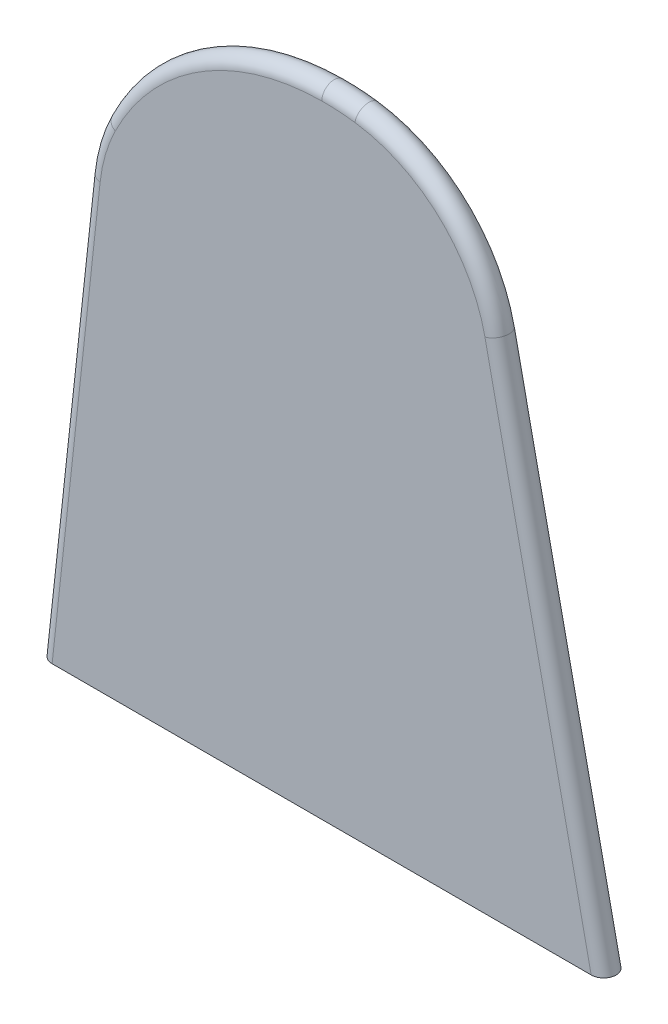
ISO-10303-21;
HEADER;
FILE_DESCRIPTION(('STEP AP214'),'2;1');
FILE_NAME('part.step','',(''),(''),'','','');
FILE_SCHEMA(('AUTOMOTIVE_DESIGN { 1 0 10303 214 1 1 1 1 }'));
ENDSEC;
DATA;
#1=APPLICATION_CONTEXT('core data for automotive mechanical design processes');
#2=APPLICATION_PROTOCOL_DEFINITION('international standard','automotive_design',2000,#1);
#3=PRODUCT_CONTEXT('',#1,'mechanical');
#4=PRODUCT('Part','Part','',(#3));
#5=PRODUCT_RELATED_PRODUCT_CATEGORY('part','',(#4));
#6=PRODUCT_DEFINITION_FORMATION('','',#4);
#7=PRODUCT_DEFINITION_CONTEXT('part definition',#1,'design');
#8=PRODUCT_DEFINITION('design','',#6,#7);
#9=PRODUCT_DEFINITION_SHAPE('','',#8);
#10=(LENGTH_UNIT() NAMED_UNIT(*) SI_UNIT(.MILLI.,.METRE.));
#11=(NAMED_UNIT(*) PLANE_ANGLE_UNIT() SI_UNIT($,.RADIAN.));
#12=(NAMED_UNIT(*) SI_UNIT($,.STERADIAN.) SOLID_ANGLE_UNIT());
#13=UNCERTAINTY_MEASURE_WITH_UNIT(LENGTH_MEASURE(1.E-05),#10,'distance_accuracy_value','');
#14=(GEOMETRIC_REPRESENTATION_CONTEXT(3) GLOBAL_UNCERTAINTY_ASSIGNED_CONTEXT((#13)) GLOBAL_UNIT_ASSIGNED_CONTEXT((#10,
#11,#12)) REPRESENTATION_CONTEXT('',''));
#15=CARTESIAN_POINT('',(0.,0.,0.));
#16=DIRECTION('',(0.,0.,1.));
#17=DIRECTION('',(1.,0.,0.));
#18=AXIS2_PLACEMENT_3D('',#15,#16,#17);
#19=CARTESIAN_POINT('',(1.10745661042956,42.0916931068543,1.105));
#20=DIRECTION('',(0.,0.,-1.));
#21=DIRECTION('',(-1.,0.,0.));
#22=AXIS2_PLACEMENT_3D('',#19,#20,#21);
#23=TOROIDAL_SURFACE('',#22,13.895,1.105);
#24=CARTESIAN_POINT('',(14.6981710796887,44.9836656542811,1.105));
#25=DIRECTION('',(0.208130446018487,-0.978101077312639,0.));
#26=DIRECTION('',(0.978101077312639,0.208130446018487,0.));
#27=AXIS2_PLACEMENT_3D('',#24,#25,#26);
#28=CIRCLE('',#27,1.105);
#29=CARTESIAN_POINT('',(14.6981710796887,44.9836656542811,0.));
#30=VERTEX_POINT('',#29);
#31=CARTESIAN_POINT('',(14.6981710796887,44.9836656542811,2.21));
#32=VERTEX_POINT('',#31);
#33=EDGE_CURVE('E11',#30,#32,#28,.T.);
#34=ORIENTED_EDGE('',*,*,#33,.F.);
#35=CARTESIAN_POINT('',(1.10745661042956,42.0916931068543,0.));
#36=DIRECTION('',(0.,0.,1.));
#37=DIRECTION('',(1.,0.,0.));
#38=AXIS2_PLACEMENT_3D('',#35,#36,#37);
#39=CIRCLE('',#38,13.895);
#40=CARTESIAN_POINT('',(2.98857642483766,55.8587702564834,0.));
#41=VERTEX_POINT('',#40);
#42=EDGE_CURVE('E138',#41,#30,#39,.F.);
#43=ORIENTED_EDGE('',*,*,#42,.F.);
#44=CARTESIAN_POINT('',(2.98857642483766,55.8587702564834,1.105));
#45=DIRECTION('',(0.990793605586841,-0.135381058971435,0.));
#46=DIRECTION('',(0.135381058971435,0.990793605586841,0.));
#47=AXIS2_PLACEMENT_3D('',#44,#45,#46);
#48=CIRCLE('',#47,1.105);
#49=CARTESIAN_POINT('',(2.98857642483766,55.8587702564834,2.21));
#50=VERTEX_POINT('',#49);
#51=EDGE_CURVE('E54',#41,#50,#48,.T.);
#52=ORIENTED_EDGE('',*,*,#51,.T.);
#53=CARTESIAN_POINT('',(1.10745661042956,42.0916931068543,2.21));
#54=DIRECTION('',(0.,0.,1.));
#55=DIRECTION('',(1.,0.,0.));
#56=AXIS2_PLACEMENT_3D('',#53,#54,#55);
#57=CIRCLE('',#56,13.895);
#58=EDGE_CURVE('E154',#32,#50,#57,.T.);
#59=ORIENTED_EDGE('',*,*,#58,.F.);
#60=EDGE_LOOP('',(#34,#43,#52,#59));
#61=FACE_BOUND('',#60,.T.);
#62=ADVANCED_FACE('F44',(#61),#23,.T.);
#63=CARTESIAN_POINT('',(0.23166644895376,35.6821754208597,1.105));
#64=DIRECTION('',(0.,0.,-1.));
#65=DIRECTION('',(-1.,0.,0.));
#66=AXIS2_PLACEMENT_3D('',#63,#64,#65);
#67=TOROIDAL_SURFACE('',#66,20.3640745376765,1.105);
#68=ORIENTED_EDGE('',*,*,#51,.F.);
#69=CARTESIAN_POINT('',(0.23166644895376,35.6821754208597,0.));
#70=DIRECTION('',(0.,0.,1.));
#71=DIRECTION('',(1.,0.,0.));
#72=AXIS2_PLACEMENT_3D('',#69,#70,#71);
#73=CIRCLE('',#72,20.3640745376765);
#74=CARTESIAN_POINT('',(0.0102684173896577,56.0450477116163,0.));
#75=VERTEX_POINT('',#74);
#76=EDGE_CURVE('E141',#75,#41,#73,.F.);
#77=ORIENTED_EDGE('',*,*,#76,.F.);
#78=CARTESIAN_POINT('',(0.0102684173896576,56.0450477116163,1.105));
#79=DIRECTION('',(0.999956822066671,0.00929268542050462,0.));
#80=DIRECTION('',(-0.00929268542050462,0.999956822066671,0.));
#81=AXIS2_PLACEMENT_3D('',#78,#79,#80);
#82=CIRCLE('',#81,1.105);
#83=CARTESIAN_POINT('',(0.0102684173896577,56.0450477116163,2.21));
#84=VERTEX_POINT('',#83);
#85=EDGE_CURVE('E179',#75,#84,#82,.T.);
#86=ORIENTED_EDGE('',*,*,#85,.T.);
#87=CARTESIAN_POINT('',(0.23166644895376,35.6821754208597,2.21));
#88=DIRECTION('',(0.,0.,1.));
#89=DIRECTION('',(1.,0.,0.));
#90=AXIS2_PLACEMENT_3D('',#87,#88,#89);
#91=CIRCLE('',#90,20.3640745376765);
#92=EDGE_CURVE('E158',#50,#84,#91,.T.);
#93=ORIENTED_EDGE('',*,*,#92,.F.);
#94=EDGE_LOOP('',(#68,#77,#86,#93));
#95=FACE_BOUND('',#94,.T.);
#96=ADVANCED_FACE('F188',(#95),#67,.T.);
#97=CARTESIAN_POINT('',(0.171916629091972,35.0949345321954,1.105));
#98=DIRECTION('',(0.,0.,-1.));
#99=DIRECTION('',(-1.,0.,0.));
#100=AXIS2_PLACEMENT_3D('',#97,#98,#99);
#101=TOROIDAL_SURFACE('',#100,20.9507354925313,1.105);
#102=ORIENTED_EDGE('',*,*,#85,.F.);
#103=CARTESIAN_POINT('',(0.171916629091972,35.0949345321954,0.));
#104=DIRECTION('',(0.,0.,1.));
#105=DIRECTION('',(1.,0.,0.));
#106=AXIS2_PLACEMENT_3D('',#103,#104,#105);
#107=CIRCLE('',#106,20.9507354925313);
#108=CARTESIAN_POINT('',(-18.5994929580406,44.399100254608,0.));
#109=VERTEX_POINT('',#108);
#110=EDGE_CURVE('E145',#109,#75,#107,.F.);
#111=ORIENTED_EDGE('',*,*,#110,.F.);
#112=CARTESIAN_POINT('',(-18.5994929580406,44.399100254608,1.105));
#113=DIRECTION('',(0.444097331367172,0.895978549002462,0.));
#114=DIRECTION('',(-0.895978549002462,0.444097331367172,0.));
#115=AXIS2_PLACEMENT_3D('',#112,#113,#114);
#116=CIRCLE('',#115,1.105);
#117=CARTESIAN_POINT('',(-18.5994929580406,44.399100254608,2.21));
#118=VERTEX_POINT('',#117);
#119=EDGE_CURVE('E69',#109,#118,#116,.T.);
#120=ORIENTED_EDGE('',*,*,#119,.T.);
#121=CARTESIAN_POINT('',(0.171916629091972,35.0949345321954,2.21));
#122=DIRECTION('',(0.,0.,1.));
#123=DIRECTION('',(1.,0.,0.));
#124=AXIS2_PLACEMENT_3D('',#121,#122,#123);
#125=CIRCLE('',#124,20.9507354925313);
#126=EDGE_CURVE('E162',#84,#118,#125,.T.);
#127=ORIENTED_EDGE('',*,*,#126,.F.);
#128=EDGE_LOOP('',(#102,#111,#120,#127));
#129=FACE_BOUND('',#128,.T.);
#130=ADVANCED_FACE('F193',(#129),#101,.T.);
#131=CARTESIAN_POINT('',(-6.14987101965136,38.2283678352612,1.105));
#132=DIRECTION('',(0.,0.,-1.));
#133=DIRECTION('',(-1.,0.,0.));
#134=AXIS2_PLACEMENT_3D('',#131,#132,#133);
#135=TOROIDAL_SURFACE('',#134,13.895,1.105);
#136=ORIENTED_EDGE('',*,*,#119,.F.);
#137=CARTESIAN_POINT('',(-6.14987101965136,38.2283678352612,0.));
#138=DIRECTION('',(0.,0.,1.));
#139=DIRECTION('',(1.,0.,0.));
#140=AXIS2_PLACEMENT_3D('',#137,#138,#139);
#141=CIRCLE('',#140,13.895);
#142=CARTESIAN_POINT('',(-19.9632653209216,39.7320841907066,0.));
#143=VERTEX_POINT('',#142);
#144=EDGE_CURVE('E124',#143,#109,#141,.F.);
#145=ORIENTED_EDGE('',*,*,#144,.F.);
#146=CARTESIAN_POINT('',(-19.9632653209216,39.7320841907066,1.105));
#147=DIRECTION('',(0.10821996080931,0.994126973822978,0.));
#148=DIRECTION('',(-0.994126973822978,0.10821996080931,0.));
#149=AXIS2_PLACEMENT_3D('',#146,#147,#148);
#150=CIRCLE('',#149,1.105);
#151=CARTESIAN_POINT('',(-19.9632653209216,39.7320841907066,2.21));
#152=VERTEX_POINT('',#151);
#153=EDGE_CURVE('E61',#143,#152,#150,.T.);
#154=ORIENTED_EDGE('',*,*,#153,.T.);
#155=CARTESIAN_POINT('',(-6.14987101965136,38.2283678352612,2.21));
#156=DIRECTION('',(0.,0.,1.));
#157=DIRECTION('',(1.,0.,0.));
#158=AXIS2_PLACEMENT_3D('',#155,#156,#157);
#159=CIRCLE('',#158,13.895);
#160=EDGE_CURVE('E166',#118,#152,#159,.T.);
#161=ORIENTED_EDGE('',*,*,#160,.F.);
#162=EDGE_LOOP('',(#136,#145,#154,#161));
#163=FACE_BOUND('',#162,.T.);
#164=ADVANCED_FACE('F194',(#163),#135,.T.);
#165=CARTESIAN_POINT('',(-24.2884719667643,0.,1.105));
#166=DIRECTION('',(0.108219960809314,0.994126973822977,0.));
#167=DIRECTION('',(-0.994126973822977,0.108219960809314,0.));
#168=AXIS2_PLACEMENT_3D('',#165,#166,#167);
#169=CYLINDRICAL_SURFACE('',#168,1.105);
#170=ORIENTED_EDGE('',*,*,#153,.F.);
#171=DIRECTION('',(-0.108219960809314,-0.994126973822977,0.));
#172=VECTOR('',#171,1.);
#173=CARTESIAN_POINT('',(-24.2884719667643,0.,0.));
#174=LINE('',#173,#172);
#175=CARTESIAN_POINT('',(-24.2884719667643,0.,0.));
#176=VERTEX_POINT('',#175);
#177=EDGE_CURVE('E118',#176,#143,#174,.F.);
#178=ORIENTED_EDGE('',*,*,#177,.F.);
#179=CARTESIAN_POINT('',(-24.2884719667643,0.,1.105));
#180=DIRECTION('',(0.,1.,0.));
#181=DIRECTION('',(1.,0.,0.));
#182=AXIS2_PLACEMENT_3D('',#179,#180,#181);
#183=ELLIPSE('',#182,1.11152803323569,1.105);
#184=CARTESIAN_POINT('',(-24.2884719667643,0.,2.21));
#185=VERTEX_POINT('',#184);
#186=EDGE_CURVE('E105',#185,#176,#183,.F.);
#187=ORIENTED_EDGE('',*,*,#186,.F.);
#188=DIRECTION('',(0.108219960809314,0.994126973822977,0.));
#189=VECTOR('',#188,1.);
#190=CARTESIAN_POINT('',(-24.0040160720193,2.61306024982945,2.21));
#191=LINE('',#190,#189);
#192=EDGE_CURVE('E170',#152,#185,#191,.F.);
#193=ORIENTED_EDGE('',*,*,#192,.F.);
#194=EDGE_LOOP('',(#170,#178,#187,#193));
#195=FACE_BOUND('',#194,.T.);
#196=ADVANCED_FACE('F119',(#195),#169,.T.);
#197=CARTESIAN_POINT('',(14.6981710796887,44.9836656542811,1.105));
#198=DIRECTION('',(0.208130446018488,-0.978101077312639,0.));
#199=DIRECTION('',(0.978101077312639,0.208130446018488,0.));
#200=AXIS2_PLACEMENT_3D('',#197,#198,#199);
#201=CYLINDRICAL_SURFACE('',#200,1.105);
#202=DIRECTION('',(0.208130446018488,-0.978101077312639,0.));
#203=VECTOR('',#202,1.);
#204=CARTESIAN_POINT('',(23.2189139325492,4.94076023934454,0.));
#205=LINE('',#204,#203);
#206=CARTESIAN_POINT('',(24.2702599090924,0.,0.));
#207=VERTEX_POINT('',#206);
#208=EDGE_CURVE('E130',#30,#207,#205,.T.);
#209=ORIENTED_EDGE('',*,*,#208,.F.);
#210=ORIENTED_EDGE('',*,*,#33,.T.);
#211=DIRECTION('',(-0.208130446018488,0.978101077312639,0.));
#212=VECTOR('',#211,1.);
#213=CARTESIAN_POINT('',(14.6981710796887,44.9836656542811,2.21));
#214=LINE('',#213,#212);
#215=CARTESIAN_POINT('',(24.2702599090924,0.,2.21));
#216=VERTEX_POINT('',#215);
#217=EDGE_CURVE('E123',#216,#32,#214,.T.);
#218=ORIENTED_EDGE('',*,*,#217,.F.);
#219=CARTESIAN_POINT('',(24.2702599090924,0.,1.105));
#220=DIRECTION('',(0.,1.,0.));
#221=DIRECTION('',(1.,0.,0.));
#222=AXIS2_PLACEMENT_3D('',#219,#220,#221);
#223=ELLIPSE('',#222,1.1297400909076,1.105);
#224=EDGE_CURVE('E115',#207,#216,#223,.F.);
#225=ORIENTED_EDGE('',*,*,#224,.F.);
#226=EDGE_LOOP('',(#209,#210,#218,#225));
#227=FACE_BOUND('',#226,.T.);
#228=ADVANCED_FACE('F47',(#227),#201,.T.);
#229=CARTESIAN_POINT('',(0.,0.,2.21));
#230=DIRECTION('',(0.,1.,0.));
#231=DIRECTION('',(0.,0.,1.));
#232=AXIS2_PLACEMENT_3D('',#229,#230,#231);
#233=PLANE('',#232);
#234=DIRECTION('',(1.,0.,0.));
#235=VECTOR('',#234,1.);
#236=CARTESIAN_POINT('',(0.,0.,2.21));
#237=LINE('',#236,#235);
#238=EDGE_CURVE('E111',#185,#216,#237,.T.);
#239=ORIENTED_EDGE('',*,*,#238,.F.);
#240=ORIENTED_EDGE('',*,*,#186,.T.);
#241=DIRECTION('',(1.,0.,0.));
#242=VECTOR('',#241,1.);
#243=CARTESIAN_POINT('',(0.,0.,0.));
#244=LINE('',#243,#242);
#245=EDGE_CURVE('E109',#176,#207,#244,.T.);
#246=ORIENTED_EDGE('',*,*,#245,.T.);
#247=ORIENTED_EDGE('',*,*,#224,.T.);
#248=EDGE_LOOP('',(#239,#240,#246,#247));
#249=FACE_BOUND('',#248,.T.);
#250=ADVANCED_FACE('F107',(#249),#233,.F.);
#251=CARTESIAN_POINT('',(0.,0.,2.21));
#252=DIRECTION('',(0.,0.,1.));
#253=DIRECTION('',(1.,0.,0.));
#254=AXIS2_PLACEMENT_3D('',#251,#252,#253);
#255=PLANE('',#254);
#256=ORIENTED_EDGE('',*,*,#160,.T.);
#257=ORIENTED_EDGE('',*,*,#192,.T.);
#258=ORIENTED_EDGE('',*,*,#238,.T.);
#259=ORIENTED_EDGE('',*,*,#217,.T.);
#260=ORIENTED_EDGE('',*,*,#58,.T.);
#261=ORIENTED_EDGE('',*,*,#92,.T.);
#262=ORIENTED_EDGE('',*,*,#126,.T.);
#263=EDGE_LOOP('',(#256,#257,#258,#259,#260,#261,#262));
#264=FACE_BOUND('',#263,.T.);
#265=ADVANCED_FACE('F190',(#264),#255,.T.);
#266=CARTESIAN_POINT('',(0.,0.,0.));
#267=DIRECTION('',(0.,0.,1.));
#268=DIRECTION('',(1.,0.,0.));
#269=AXIS2_PLACEMENT_3D('',#266,#267,#268);
#270=PLANE('',#269);
#271=ORIENTED_EDGE('',*,*,#245,.F.);
#272=ORIENTED_EDGE('',*,*,#177,.T.);
#273=ORIENTED_EDGE('',*,*,#144,.T.);
#274=ORIENTED_EDGE('',*,*,#110,.T.);
#275=ORIENTED_EDGE('',*,*,#76,.T.);
#276=ORIENTED_EDGE('',*,*,#42,.T.);
#277=ORIENTED_EDGE('',*,*,#208,.T.);
#278=EDGE_LOOP('',(#271,#272,#273,#274,#275,#276,#277));
#279=FACE_BOUND('',#278,.T.);
#280=ADVANCED_FACE('F127',(#279),#270,.F.);
#281=CLOSED_SHELL('',(#62,#96,#130,#164,#196,#228,#250,#265,#280));
#282=MANIFOLD_SOLID_BREP('B2',#281);
#283=ADVANCED_BREP_SHAPE_REPRESENTATION('',(#18,#282),#14);
#284=SHAPE_DEFINITION_REPRESENTATION(#9,#283);
ENDSEC;
END-ISO-10303-21;
